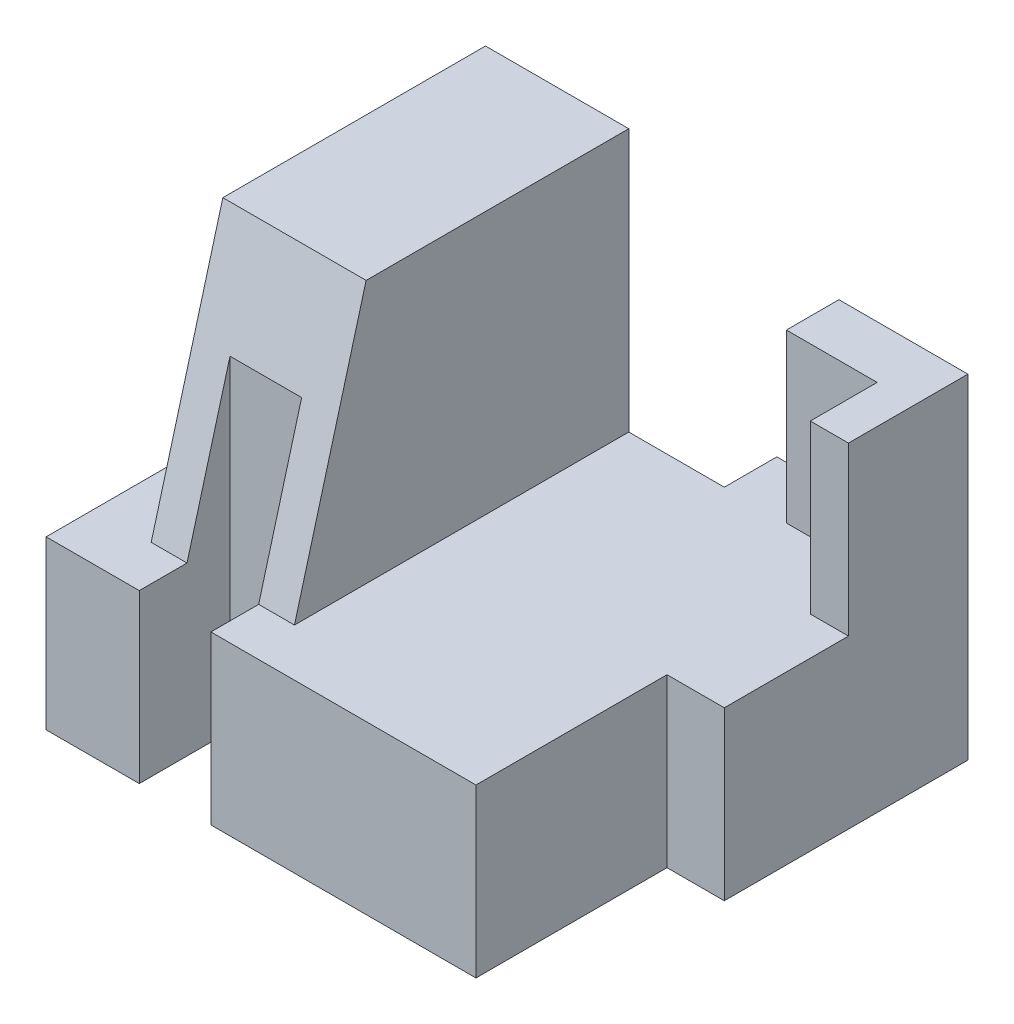
ISO-10303-21;
HEADER;
FILE_DESCRIPTION(('STEP AP214'),'2;1');
FILE_NAME('part.step','',(''),(''),'','','');
FILE_SCHEMA(('AUTOMOTIVE_DESIGN { 1 0 10303 214 1 1 1 1 }'));
ENDSEC;
DATA;
#1=APPLICATION_CONTEXT('core data for automotive mechanical design processes');
#2=APPLICATION_PROTOCOL_DEFINITION('international standard','automotive_design',2000,#1);
#3=PRODUCT_CONTEXT('',#1,'mechanical');
#4=PRODUCT('Part','Part','',(#3));
#5=PRODUCT_RELATED_PRODUCT_CATEGORY('part','',(#4));
#6=PRODUCT_DEFINITION_FORMATION('','',#4);
#7=PRODUCT_DEFINITION_CONTEXT('part definition',#1,'design');
#8=PRODUCT_DEFINITION('design','',#6,#7);
#9=PRODUCT_DEFINITION_SHAPE('','',#8);
#10=(LENGTH_UNIT() NAMED_UNIT(*) SI_UNIT(.MILLI.,.METRE.));
#11=(NAMED_UNIT(*) PLANE_ANGLE_UNIT() SI_UNIT($,.RADIAN.));
#12=(NAMED_UNIT(*) SI_UNIT($,.STERADIAN.) SOLID_ANGLE_UNIT());
#13=UNCERTAINTY_MEASURE_WITH_UNIT(LENGTH_MEASURE(1.E-05),#10,'distance_accuracy_value','');
#14=(GEOMETRIC_REPRESENTATION_CONTEXT(3) GLOBAL_UNCERTAINTY_ASSIGNED_CONTEXT((#13)) GLOBAL_UNIT_ASSIGNED_CONTEXT((#10,
#11,#12)) REPRESENTATION_CONTEXT('',''));
#15=CARTESIAN_POINT('',(0.,0.,0.));
#16=DIRECTION('',(0.,0.,1.));
#17=DIRECTION('',(1.,0.,0.));
#18=AXIS2_PLACEMENT_3D('',#15,#16,#17);
#19=CARTESIAN_POINT('',(0.,17.5,80.));
#20=DIRECTION('',(0.,1.,0.));
#21=DIRECTION('',(0.,0.,1.));
#22=AXIS2_PLACEMENT_3D('',#19,#20,#21);
#23=PLANE('',#22);
#24=DIRECTION('',(0.,0.,1.));
#25=VECTOR('',#24,1.);
#26=CARTESIAN_POINT('',(49.,17.5,14.));
#27=LINE('',#26,#25);
#28=CARTESIAN_POINT('',(49.,17.5,0.));
#29=VERTEX_POINT('',#28);
#30=CARTESIAN_POINT('',(49.,17.5,14.));
#31=VERTEX_POINT('',#30);
#32=EDGE_CURVE('E211',#29,#31,#27,.T.);
#33=ORIENTED_EDGE('',*,*,#32,.F.);
#34=DIRECTION('',(-1.,0.,0.));
#35=VECTOR('',#34,1.);
#36=CARTESIAN_POINT('',(0.,17.5,0.));
#37=LINE('',#36,#35);
#38=CARTESIAN_POINT('',(30.,17.5,0.));
#39=VERTEX_POINT('',#38);
#40=EDGE_CURVE('E222',#29,#39,#37,.T.);
#41=ORIENTED_EDGE('',*,*,#40,.T.);
#42=DIRECTION('',(0.,0.,1.));
#43=VECTOR('',#42,1.);
#44=CARTESIAN_POINT('',(30.,17.5,0.));
#45=LINE('',#44,#43);
#46=CARTESIAN_POINT('',(30.,17.5,-11.));
#47=VERTEX_POINT('',#46);
#48=EDGE_CURVE('E235',#47,#39,#45,.T.);
#49=ORIENTED_EDGE('',*,*,#48,.F.);
#50=DIRECTION('',(1.,0.,0.));
#51=VECTOR('',#50,1.);
#52=CARTESIAN_POINT('',(0.,17.5,-11.));
#53=LINE('',#52,#51);
#54=CARTESIAN_POINT('',(17.,17.5,-11.));
#55=VERTEX_POINT('',#54);
#56=EDGE_CURVE('E260',#55,#47,#53,.T.);
#57=ORIENTED_EDGE('',*,*,#56,.F.);
#58=DIRECTION('',(0.,0.,-1.));
#59=VECTOR('',#58,1.);
#60=CARTESIAN_POINT('',(17.,17.5,0.));
#61=LINE('',#60,#59);
#62=CARTESIAN_POINT('',(17.,17.5,0.));
#63=VERTEX_POINT('',#62);
#64=EDGE_CURVE('E263',#63,#55,#61,.T.);
#65=ORIENTED_EDGE('',*,*,#64,.F.);
#66=DIRECTION('',(1.,0.,0.));
#67=VECTOR('',#66,1.);
#68=CARTESIAN_POINT('',(0.,17.5,0.));
#69=LINE('',#68,#67);
#70=CARTESIAN_POINT('',(-3.00000000000004,17.5,0.));
#71=VERTEX_POINT('',#70);
#72=EDGE_CURVE('E363',#71,#63,#69,.T.);
#73=ORIENTED_EDGE('',*,*,#72,.F.);
#74=DIRECTION('',(0.,0.,1.));
#75=VECTOR('',#74,1.);
#76=CARTESIAN_POINT('',(-3.00000000000004,17.5,70.));
#77=LINE('',#76,#75);
#78=CARTESIAN_POINT('',(-3.00000000000004,17.5,70.));
#79=VERTEX_POINT('',#78);
#80=EDGE_CURVE('E299',#71,#79,#77,.T.);
#81=ORIENTED_EDGE('',*,*,#80,.T.);
#82=DIRECTION('',(-1.,0.,0.));
#83=VECTOR('',#82,1.);
#84=CARTESIAN_POINT('',(-3.00000000000004,17.5,70.));
#85=LINE('',#84,#83);
#86=CARTESIAN_POINT('',(-10.5,17.5,70.));
#87=VERTEX_POINT('',#86);
#88=EDGE_CURVE('E346',#79,#87,#85,.T.);
#89=ORIENTED_EDGE('',*,*,#88,.T.);
#90=DIRECTION('',(0.,0.,-1.));
#91=VECTOR('',#90,1.);
#92=CARTESIAN_POINT('',(-10.5,17.5,80.));
#93=LINE('',#92,#91);
#94=CARTESIAN_POINT('',(-10.5,17.5,80.));
#95=VERTEX_POINT('',#94);
#96=EDGE_CURVE('E292',#95,#87,#93,.T.);
#97=ORIENTED_EDGE('',*,*,#96,.F.);
#98=DIRECTION('',(1.,0.,0.));
#99=VECTOR('',#98,1.);
#100=CARTESIAN_POINT('',(0.,17.5,80.));
#101=LINE('',#100,#99);
#102=CARTESIAN_POINT('',(45.,17.5,80.));
#103=VERTEX_POINT('',#102);
#104=EDGE_CURVE('E344',#95,#103,#101,.T.);
#105=ORIENTED_EDGE('',*,*,#104,.T.);
#106=DIRECTION('',(0.,0.,-1.));
#107=VECTOR('',#106,1.);
#108=CARTESIAN_POINT('',(45.,17.5,80.));
#109=LINE('',#108,#107);
#110=CARTESIAN_POINT('',(45.,17.5,40.));
#111=VERTEX_POINT('',#110);
#112=EDGE_CURVE('E206',#103,#111,#109,.T.);
#113=ORIENTED_EDGE('',*,*,#112,.T.);
#114=DIRECTION('',(1.,0.,0.));
#115=VECTOR('',#114,1.);
#116=CARTESIAN_POINT('',(0.,17.5,40.));
#117=LINE('',#116,#115);
#118=CARTESIAN_POINT('',(57.,17.5,40.));
#119=VERTEX_POINT('',#118);
#120=EDGE_CURVE('E247',#111,#119,#117,.T.);
#121=ORIENTED_EDGE('',*,*,#120,.T.);
#122=DIRECTION('',(0.,0.,-1.));
#123=VECTOR('',#122,1.);
#124=CARTESIAN_POINT('',(57.,17.5,0.));
#125=LINE('',#124,#123);
#126=CARTESIAN_POINT('',(57.,17.5,14.));
#127=VERTEX_POINT('',#126);
#128=EDGE_CURVE('E257',#119,#127,#125,.T.);
#129=ORIENTED_EDGE('',*,*,#128,.T.);
#130=DIRECTION('',(1.,0.,0.));
#131=VECTOR('',#130,1.);
#132=CARTESIAN_POINT('',(0.,17.5,14.));
#133=LINE('',#132,#131);
#134=EDGE_CURVE('E213',#31,#127,#133,.T.);
#135=ORIENTED_EDGE('',*,*,#134,.F.);
#136=EDGE_LOOP('',(#33,#41,#49,#57,#65,#73,#81,#89,#97,#105,#113,#121,#129,#135));
#137=FACE_BOUND('',#136,.T.);
#138=ADVANCED_FACE('F34',(#137),#23,.T.);
#139=CARTESIAN_POINT('',(0.,0.,0.));
#140=DIRECTION('',(0.,0.,1.));
#141=DIRECTION('',(1.,0.,0.));
#142=AXIS2_PLACEMENT_3D('',#139,#140,#141);
#143=PLANE('',#142);
#144=DIRECTION('',(0.,1.,0.));
#145=VECTOR('',#144,1.);
#146=CARTESIAN_POINT('',(17.,0.,0.));
#147=LINE('',#146,#145);
#148=CARTESIAN_POINT('',(17.,-17.5,0.));
#149=VERTEX_POINT('',#148);
#150=EDGE_CURVE('E11',#149,#63,#147,.T.);
#151=ORIENTED_EDGE('',*,*,#150,.F.);
#152=DIRECTION('',(1.,0.,0.));
#153=VECTOR('',#152,1.);
#154=CARTESIAN_POINT('',(0.,-17.5,0.));
#155=LINE('',#154,#153);
#156=CARTESIAN_POINT('',(-45.,-17.5,0.));
#157=VERTEX_POINT('',#156);
#158=EDGE_CURVE('E348',#157,#149,#155,.T.);
#159=ORIENTED_EDGE('',*,*,#158,.F.);
#160=DIRECTION('',(0.,1.,0.));
#161=VECTOR('',#160,1.);
#162=CARTESIAN_POINT('',(-45.,0.,0.));
#163=LINE('',#162,#161);
#164=CARTESIAN_POINT('',(-45.,17.5,0.));
#165=VERTEX_POINT('',#164);
#166=EDGE_CURVE('E352',#157,#165,#163,.T.);
#167=ORIENTED_EDGE('',*,*,#166,.T.);
#168=CARTESIAN_POINT('',(-33.,17.5,0.));
#169=VERTEX_POINT('',#168);
#170=EDGE_CURVE('E366',#165,#169,#69,.T.);
#171=ORIENTED_EDGE('',*,*,#170,.T.);
#172=DIRECTION('',(0.,-1.,0.));
#173=VECTOR('',#172,1.);
#174=CARTESIAN_POINT('',(-33.,17.5,0.));
#175=LINE('',#174,#173);
#176=CARTESIAN_POINT('',(-33.,72.5,0.));
#177=VERTEX_POINT('',#176);
#178=EDGE_CURVE('E313',#177,#169,#175,.T.);
#179=ORIENTED_EDGE('',*,*,#178,.F.);
#180=DIRECTION('',(-1.,0.,0.));
#181=VECTOR('',#180,1.);
#182=CARTESIAN_POINT('',(-3.00000000000004,72.5,0.));
#183=LINE('',#182,#181);
#184=CARTESIAN_POINT('',(-3.00000000000004,72.5,0.));
#185=VERTEX_POINT('',#184);
#186=EDGE_CURVE('E413',#185,#177,#183,.T.);
#187=ORIENTED_EDGE('',*,*,#186,.F.);
#188=DIRECTION('',(0.,-1.,0.));
#189=VECTOR('',#188,1.);
#190=CARTESIAN_POINT('',(-3.00000000000004,17.5,0.));
#191=LINE('',#190,#189);
#192=EDGE_CURVE('E302',#185,#71,#191,.T.);
#193=ORIENTED_EDGE('',*,*,#192,.T.);
#194=ORIENTED_EDGE('',*,*,#72,.T.);
#195=EDGE_LOOP('',(#151,#159,#167,#171,#179,#187,#193,#194));
#196=FACE_BOUND('',#195,.T.);
#197=ADVANCED_FACE('F407',(#196),#143,.F.);
#198=CARTESIAN_POINT('',(0.,0.,80.));
#199=DIRECTION('',(0.,0.,1.));
#200=DIRECTION('',(1.,0.,0.));
#201=AXIS2_PLACEMENT_3D('',#198,#199,#200);
#202=PLANE('',#201);
#203=DIRECTION('',(0.,1.,0.));
#204=VECTOR('',#203,1.);
#205=CARTESIAN_POINT('',(-10.5,-17.5,80.));
#206=LINE('',#205,#204);
#207=CARTESIAN_POINT('',(-10.5,-17.5,80.));
#208=VERTEX_POINT('',#207);
#209=EDGE_CURVE('E192',#208,#95,#206,.T.);
#210=ORIENTED_EDGE('',*,*,#209,.F.);
#211=DIRECTION('',(1.,0.,0.));
#212=VECTOR('',#211,1.);
#213=CARTESIAN_POINT('',(0.,-17.5,80.));
#214=LINE('',#213,#212);
#215=CARTESIAN_POINT('',(45.,-17.5,80.));
#216=VERTEX_POINT('',#215);
#217=EDGE_CURVE('E186',#208,#216,#214,.T.);
#218=ORIENTED_EDGE('',*,*,#217,.T.);
#219=DIRECTION('',(0.,1.,0.));
#220=VECTOR('',#219,1.);
#221=CARTESIAN_POINT('',(45.,17.5,80.));
#222=LINE('',#221,#220);
#223=EDGE_CURVE('E191',#216,#103,#222,.T.);
#224=ORIENTED_EDGE('',*,*,#223,.T.);
#225=ORIENTED_EDGE('',*,*,#104,.F.);
#226=EDGE_LOOP('',(#210,#218,#224,#225));
#227=FACE_BOUND('',#226,.T.);
#228=ADVANCED_FACE('F188',(#227),#202,.T.);
#229=DIRECTION('',(0.,0.,1.));
#230=VECTOR('',#229,1.);
#231=CARTESIAN_POINT('',(-25.5,17.5,80.));
#232=LINE('',#231,#230);
#233=CARTESIAN_POINT('',(-25.5,17.5,70.));
#234=VERTEX_POINT('',#233);
#235=CARTESIAN_POINT('',(-25.5,17.5,80.));
#236=VERTEX_POINT('',#235);
#237=EDGE_CURVE('E283',#234,#236,#232,.T.);
#238=ORIENTED_EDGE('',*,*,#237,.F.);
#239=CARTESIAN_POINT('',(-33.,17.5,70.));
#240=VERTEX_POINT('',#239);
#241=EDGE_CURVE('E425',#234,#240,#85,.T.);
#242=ORIENTED_EDGE('',*,*,#241,.T.);
#243=DIRECTION('',(0.,0.,1.));
#244=VECTOR('',#243,1.);
#245=CARTESIAN_POINT('',(-33.,17.5,70.));
#246=LINE('',#245,#244);
#247=EDGE_CURVE('E294',#169,#240,#246,.T.);
#248=ORIENTED_EDGE('',*,*,#247,.F.);
#249=ORIENTED_EDGE('',*,*,#170,.F.);
#250=DIRECTION('',(0.,0.,-1.));
#251=VECTOR('',#250,1.);
#252=CARTESIAN_POINT('',(-45.,17.5,80.));
#253=LINE('',#252,#251);
#254=CARTESIAN_POINT('',(-45.,17.5,80.));
#255=VERTEX_POINT('',#254);
#256=EDGE_CURVE('E321',#255,#165,#253,.T.);
#257=ORIENTED_EDGE('',*,*,#256,.F.);
#258=EDGE_CURVE('E347',#255,#236,#101,.T.);
#259=ORIENTED_EDGE('',*,*,#258,.T.);
#260=EDGE_LOOP('',(#238,#242,#248,#249,#257,#259));
#261=FACE_BOUND('',#260,.T.);
#262=ADVANCED_FACE('F36',(#261),#23,.T.);
#263=CARTESIAN_POINT('',(-45.,0.,80.));
#264=DIRECTION('',(-1.,0.,0.));
#265=DIRECTION('',(0.,0.,1.));
#266=AXIS2_PLACEMENT_3D('',#263,#264,#265);
#267=PLANE('',#266);
#268=ORIENTED_EDGE('',*,*,#166,.F.);
#269=DIRECTION('',(0.,0.,-1.));
#270=VECTOR('',#269,1.);
#271=CARTESIAN_POINT('',(-45.,-17.5,80.));
#272=LINE('',#271,#270);
#273=CARTESIAN_POINT('',(-45.,-17.5,80.));
#274=VERTEX_POINT('',#273);
#275=EDGE_CURVE('E370',#274,#157,#272,.T.);
#276=ORIENTED_EDGE('',*,*,#275,.F.);
#277=DIRECTION('',(0.,1.,0.));
#278=VECTOR('',#277,1.);
#279=CARTESIAN_POINT('',(-45.,0.,80.));
#280=LINE('',#279,#278);
#281=EDGE_CURVE('E196',#274,#255,#280,.T.);
#282=ORIENTED_EDGE('',*,*,#281,.T.);
#283=ORIENTED_EDGE('',*,*,#256,.T.);
#284=EDGE_LOOP('',(#268,#276,#282,#283));
#285=FACE_BOUND('',#284,.T.);
#286=ADVANCED_FACE('F447',(#285),#267,.T.);
#287=CARTESIAN_POINT('',(0.,-17.5,80.));
#288=DIRECTION('',(0.,1.,0.));
#289=DIRECTION('',(0.,0.,1.));
#290=AXIS2_PLACEMENT_3D('',#287,#288,#289);
#291=PLANE('',#290);
#292=DIRECTION('',(-1.,0.,0.));
#293=VECTOR('',#292,1.);
#294=CARTESIAN_POINT('',(0.,-17.5,40.));
#295=LINE('',#294,#293);
#296=CARTESIAN_POINT('',(57.,-17.5,40.));
#297=VERTEX_POINT('',#296);
#298=CARTESIAN_POINT('',(45.,-17.5,40.));
#299=VERTEX_POINT('',#298);
#300=EDGE_CURVE('E201',#297,#299,#295,.T.);
#301=ORIENTED_EDGE('',*,*,#300,.T.);
#302=DIRECTION('',(0.,0.,1.));
#303=VECTOR('',#302,1.);
#304=CARTESIAN_POINT('',(45.,-17.5,1.92113447068046));
#305=LINE('',#304,#303);
#306=EDGE_CURVE('E199',#299,#216,#305,.T.);
#307=ORIENTED_EDGE('',*,*,#306,.T.);
#308=ORIENTED_EDGE('',*,*,#217,.F.);
#309=DIRECTION('',(0.,0.,-1.));
#310=VECTOR('',#309,1.);
#311=CARTESIAN_POINT('',(-10.5,-17.5,61.));
#312=LINE('',#311,#310);
#313=CARTESIAN_POINT('',(-10.5,-17.5,61.));
#314=VERTEX_POINT('',#313);
#315=EDGE_CURVE('E273',#208,#314,#312,.T.);
#316=ORIENTED_EDGE('',*,*,#315,.T.);
#317=DIRECTION('',(-1.,0.,0.));
#318=VECTOR('',#317,1.);
#319=CARTESIAN_POINT('',(-25.5,-17.5,61.));
#320=LINE('',#319,#318);
#321=CARTESIAN_POINT('',(-25.5,-17.5,61.));
#322=VERTEX_POINT('',#321);
#323=EDGE_CURVE('E275',#314,#322,#320,.T.);
#324=ORIENTED_EDGE('',*,*,#323,.T.);
#325=DIRECTION('',(0.,0.,1.));
#326=VECTOR('',#325,1.);
#327=CARTESIAN_POINT('',(-25.5,-17.5,61.));
#328=LINE('',#327,#326);
#329=CARTESIAN_POINT('',(-25.5,-17.5,80.));
#330=VERTEX_POINT('',#329);
#331=EDGE_CURVE('E278',#322,#330,#328,.T.);
#332=ORIENTED_EDGE('',*,*,#331,.T.);
#333=EDGE_CURVE('E195',#274,#330,#214,.T.);
#334=ORIENTED_EDGE('',*,*,#333,.F.);
#335=ORIENTED_EDGE('',*,*,#275,.T.);
#336=ORIENTED_EDGE('',*,*,#158,.T.);
#337=DIRECTION('',(0.,0.,1.));
#338=VECTOR('',#337,1.);
#339=CARTESIAN_POINT('',(17.,-17.5,0.));
#340=LINE('',#339,#338);
#341=CARTESIAN_POINT('',(17.,-17.5,-11.));
#342=VERTEX_POINT('',#341);
#343=EDGE_CURVE('E251',#342,#149,#340,.T.);
#344=ORIENTED_EDGE('',*,*,#343,.F.);
#345=DIRECTION('',(-1.,0.,0.));
#346=VECTOR('',#345,1.);
#347=CARTESIAN_POINT('',(0.,-17.5,-11.));
#348=LINE('',#347,#346);
#349=CARTESIAN_POINT('',(57.,-17.5,-11.));
#350=VERTEX_POINT('',#349);
#351=EDGE_CURVE('E248',#350,#342,#348,.T.);
#352=ORIENTED_EDGE('',*,*,#351,.F.);
#353=DIRECTION('',(0.,0.,1.));
#354=VECTOR('',#353,1.);
#355=CARTESIAN_POINT('',(57.,-17.5,0.));
#356=LINE('',#355,#354);
#357=EDGE_CURVE('E255',#350,#297,#356,.T.);
#358=ORIENTED_EDGE('',*,*,#357,.T.);
#359=EDGE_LOOP('',(#301,#307,#308,#316,#324,#332,#334,#335,#336,#344,#352,#358));
#360=FACE_BOUND('',#359,.T.);
#361=ADVANCED_FACE('F200',(#360),#291,.F.);
#362=DIRECTION('',(0.,1.,0.));
#363=VECTOR('',#362,1.);
#364=CARTESIAN_POINT('',(-25.5,-17.5,80.));
#365=LINE('',#364,#363);
#366=EDGE_CURVE('E284',#330,#236,#365,.T.);
#367=ORIENTED_EDGE('',*,*,#366,.T.);
#368=ORIENTED_EDGE('',*,*,#258,.F.);
#369=ORIENTED_EDGE('',*,*,#281,.F.);
#370=ORIENTED_EDGE('',*,*,#333,.T.);
#371=EDGE_LOOP('',(#367,#368,#369,#370));
#372=FACE_BOUND('',#371,.T.);
#373=ADVANCED_FACE('F430',(#372),#202,.T.);
#374=CARTESIAN_POINT('',(-3.00000000000004,72.5,0.));
#375=DIRECTION('',(0.,1.,0.));
#376=DIRECTION('',(0.,0.,1.));
#377=AXIS2_PLACEMENT_3D('',#374,#375,#376);
#378=PLANE('',#377);
#379=DIRECTION('',(0.,0.,-1.));
#380=VECTOR('',#379,1.);
#381=CARTESIAN_POINT('',(-33.,72.5,0.));
#382=LINE('',#381,#380);
#383=CARTESIAN_POINT('',(-33.,72.5,55.));
#384=VERTEX_POINT('',#383);
#385=EDGE_CURVE('E315',#384,#177,#382,.T.);
#386=ORIENTED_EDGE('',*,*,#385,.F.);
#387=DIRECTION('',(-1.,0.,0.));
#388=VECTOR('',#387,1.);
#389=CARTESIAN_POINT('',(-3.00000000000004,72.5,55.));
#390=LINE('',#389,#388);
#391=CARTESIAN_POINT('',(-3.00000000000004,72.5,55.));
#392=VERTEX_POINT('',#391);
#393=EDGE_CURVE('E414',#392,#384,#390,.T.);
#394=ORIENTED_EDGE('',*,*,#393,.F.);
#395=DIRECTION('',(0.,0.,-1.));
#396=VECTOR('',#395,1.);
#397=CARTESIAN_POINT('',(-3.00000000000004,72.5,0.));
#398=LINE('',#397,#396);
#399=EDGE_CURVE('E298',#392,#185,#398,.T.);
#400=ORIENTED_EDGE('',*,*,#399,.T.);
#401=ORIENTED_EDGE('',*,*,#186,.T.);
#402=EDGE_LOOP('',(#386,#394,#400,#401));
#403=FACE_BOUND('',#402,.T.);
#404=ADVANCED_FACE('F428',(#403),#378,.T.);
#405=CARTESIAN_POINT('',(-3.00000000000004,72.5,55.));
#406=DIRECTION('',(0.,0.263117405792109,0.964763821237732));
#407=DIRECTION('',(0.,-0.964763821237732,0.263117405792109));
#408=AXIS2_PLACEMENT_3D('',#405,#406,#407);
#409=PLANE('',#408);
#410=DIRECTION('',(0.,0.964763821237732,-0.263117405792109));
#411=VECTOR('',#410,1.);
#412=CARTESIAN_POINT('',(-10.5,72.5,55.));
#413=LINE('',#412,#411);
#414=CARTESIAN_POINT('',(-10.5,50.5,61.));
#415=VERTEX_POINT('',#414);
#416=EDGE_CURVE('E42',#87,#415,#413,.T.);
#417=ORIENTED_EDGE('',*,*,#416,.F.);
#418=ORIENTED_EDGE('',*,*,#88,.F.);
#419=DIRECTION('',(0.,0.964763821237732,-0.263117405792109));
#420=VECTOR('',#419,1.);
#421=CARTESIAN_POINT('',(-3.00000000000004,72.5,55.));
#422=LINE('',#421,#420);
#423=EDGE_CURVE('E295',#79,#392,#422,.T.);
#424=ORIENTED_EDGE('',*,*,#423,.T.);
#425=ORIENTED_EDGE('',*,*,#393,.T.);
#426=DIRECTION('',(0.,0.964763821237732,-0.263117405792109));
#427=VECTOR('',#426,1.);
#428=CARTESIAN_POINT('',(-33.,72.5,55.));
#429=LINE('',#428,#427);
#430=EDGE_CURVE('E305',#240,#384,#429,.T.);
#431=ORIENTED_EDGE('',*,*,#430,.F.);
#432=ORIENTED_EDGE('',*,*,#241,.F.);
#433=DIRECTION('',(0.,-0.964763821237732,0.263117405792109));
#434=VECTOR('',#433,1.);
#435=CARTESIAN_POINT('',(-25.5,72.5,55.));
#436=LINE('',#435,#434);
#437=CARTESIAN_POINT('',(-25.5,50.5,61.));
#438=VERTEX_POINT('',#437);
#439=EDGE_CURVE('E320',#438,#234,#436,.T.);
#440=ORIENTED_EDGE('',*,*,#439,.F.);
#441=DIRECTION('',(-1.,0.,0.));
#442=VECTOR('',#441,1.);
#443=CARTESIAN_POINT('',(-3.00000000000004,50.5,61.));
#444=LINE('',#443,#442);
#445=EDGE_CURVE('E318',#415,#438,#444,.T.);
#446=ORIENTED_EDGE('',*,*,#445,.F.);
#447=EDGE_LOOP('',(#417,#418,#424,#425,#431,#432,#440,#446));
#448=FACE_BOUND('',#447,.T.);
#449=ADVANCED_FACE('F332',(#448),#409,.T.);
#450=CARTESIAN_POINT('',(-3.00000000000004,0.,0.));
#451=DIRECTION('',(1.,0.,0.));
#452=DIRECTION('',(0.,0.,-1.));
#453=AXIS2_PLACEMENT_3D('',#450,#451,#452);
#454=PLANE('',#453);
#455=ORIENTED_EDGE('',*,*,#80,.F.);
#456=ORIENTED_EDGE('',*,*,#192,.F.);
#457=ORIENTED_EDGE('',*,*,#399,.F.);
#458=ORIENTED_EDGE('',*,*,#423,.F.);
#459=EDGE_LOOP('',(#455,#456,#457,#458));
#460=FACE_BOUND('',#459,.T.);
#461=ADVANCED_FACE('F436',(#460),#454,.T.);
#462=CARTESIAN_POINT('',(-33.,0.,0.));
#463=DIRECTION('',(1.,0.,0.));
#464=DIRECTION('',(0.,0.,-1.));
#465=AXIS2_PLACEMENT_3D('',#462,#463,#464);
#466=PLANE('',#465);
#467=ORIENTED_EDGE('',*,*,#247,.T.);
#468=ORIENTED_EDGE('',*,*,#430,.T.);
#469=ORIENTED_EDGE('',*,*,#385,.T.);
#470=ORIENTED_EDGE('',*,*,#178,.T.);
#471=EDGE_LOOP('',(#467,#468,#469,#470));
#472=FACE_BOUND('',#471,.T.);
#473=ADVANCED_FACE('F423',(#472),#466,.F.);
#474=CARTESIAN_POINT('',(-10.5,-17.5,61.));
#475=DIRECTION('',(1.,0.,0.));
#476=DIRECTION('',(0.,0.,-1.));
#477=AXIS2_PLACEMENT_3D('',#474,#475,#476);
#478=PLANE('',#477);
#479=ORIENTED_EDGE('',*,*,#96,.T.);
#480=ORIENTED_EDGE('',*,*,#416,.T.);
#481=DIRECTION('',(0.,1.,0.));
#482=VECTOR('',#481,1.);
#483=CARTESIAN_POINT('',(-10.5,-17.5,61.));
#484=LINE('',#483,#482);
#485=EDGE_CURVE('E281',#314,#415,#484,.T.);
#486=ORIENTED_EDGE('',*,*,#485,.F.);
#487=ORIENTED_EDGE('',*,*,#315,.F.);
#488=ORIENTED_EDGE('',*,*,#209,.T.);
#489=EDGE_LOOP('',(#479,#480,#486,#487,#488));
#490=FACE_BOUND('',#489,.T.);
#491=ADVANCED_FACE('F326',(#490),#478,.F.);
#492=CARTESIAN_POINT('',(-25.5,-17.5,61.));
#493=DIRECTION('',(-1.,0.,0.));
#494=DIRECTION('',(0.,0.,1.));
#495=AXIS2_PLACEMENT_3D('',#492,#493,#494);
#496=PLANE('',#495);
#497=ORIENTED_EDGE('',*,*,#237,.T.);
#498=ORIENTED_EDGE('',*,*,#366,.F.);
#499=ORIENTED_EDGE('',*,*,#331,.F.);
#500=DIRECTION('',(0.,1.,0.));
#501=VECTOR('',#500,1.);
#502=CARTESIAN_POINT('',(-25.5,-17.5,61.));
#503=LINE('',#502,#501);
#504=EDGE_CURVE('E287',#322,#438,#503,.T.);
#505=ORIENTED_EDGE('',*,*,#504,.T.);
#506=ORIENTED_EDGE('',*,*,#439,.T.);
#507=EDGE_LOOP('',(#497,#498,#499,#505,#506));
#508=FACE_BOUND('',#507,.T.);
#509=ADVANCED_FACE('F338',(#508),#496,.F.);
#510=CARTESIAN_POINT('',(-25.5,-17.5,61.));
#511=DIRECTION('',(0.,0.,-1.));
#512=DIRECTION('',(-1.,0.,0.));
#513=AXIS2_PLACEMENT_3D('',#510,#511,#512);
#514=PLANE('',#513);
#515=ORIENTED_EDGE('',*,*,#445,.T.);
#516=ORIENTED_EDGE('',*,*,#504,.F.);
#517=ORIENTED_EDGE('',*,*,#323,.F.);
#518=ORIENTED_EDGE('',*,*,#485,.T.);
#519=EDGE_LOOP('',(#515,#516,#517,#518));
#520=FACE_BOUND('',#519,.T.);
#521=ADVANCED_FACE('F335',(#520),#514,.F.);
#522=CARTESIAN_POINT('',(0.,-82.3151216923952,40.));
#523=DIRECTION('',(0.,0.,1.));
#524=DIRECTION('',(1.,0.,0.));
#525=AXIS2_PLACEMENT_3D('',#522,#523,#524);
#526=PLANE('',#525);
#527=DIRECTION('',(0.,-1.,0.));
#528=VECTOR('',#527,1.);
#529=CARTESIAN_POINT('',(45.,17.5,40.));
#530=LINE('',#529,#528);
#531=EDGE_CURVE('E49',#111,#299,#530,.T.);
#532=ORIENTED_EDGE('',*,*,#531,.T.);
#533=ORIENTED_EDGE('',*,*,#300,.F.);
#534=DIRECTION('',(0.,1.,0.));
#535=VECTOR('',#534,1.);
#536=CARTESIAN_POINT('',(57.,-82.3151216923952,40.));
#537=LINE('',#536,#535);
#538=EDGE_CURVE('E265',#297,#119,#537,.T.);
#539=ORIENTED_EDGE('',*,*,#538,.T.);
#540=ORIENTED_EDGE('',*,*,#120,.F.);
#541=EDGE_LOOP('',(#532,#533,#539,#540));
#542=FACE_BOUND('',#541,.T.);
#543=ADVANCED_FACE('F372',(#542),#526,.T.);
#544=CARTESIAN_POINT('',(17.,-82.3151216923952,0.));
#545=DIRECTION('',(1.,0.,0.));
#546=DIRECTION('',(0.,0.,-1.));
#547=AXIS2_PLACEMENT_3D('',#544,#545,#546);
#548=PLANE('',#547);
#549=ORIENTED_EDGE('',*,*,#343,.T.);
#550=ORIENTED_EDGE('',*,*,#150,.T.);
#551=ORIENTED_EDGE('',*,*,#64,.T.);
#552=DIRECTION('',(0.,1.,0.));
#553=VECTOR('',#552,1.);
#554=CARTESIAN_POINT('',(17.,-82.3151216923952,-11.));
#555=LINE('',#554,#553);
#556=EDGE_CURVE('E252',#342,#55,#555,.T.);
#557=ORIENTED_EDGE('',*,*,#556,.F.);
#558=EDGE_LOOP('',(#549,#550,#551,#557));
#559=FACE_BOUND('',#558,.T.);
#560=ADVANCED_FACE('F404',(#559),#548,.F.);
#561=CARTESIAN_POINT('',(0.,-82.3151216923952,-11.));
#562=DIRECTION('',(0.,0.,1.));
#563=DIRECTION('',(1.,0.,0.));
#564=AXIS2_PLACEMENT_3D('',#561,#562,#563);
#565=PLANE('',#564);
#566=DIRECTION('',(0.,1.,0.));
#567=VECTOR('',#566,1.);
#568=CARTESIAN_POINT('',(57.,-82.3151216923952,-11.));
#569=LINE('',#568,#567);
#570=CARTESIAN_POINT('',(57.,52.5,-11.));
#571=VERTEX_POINT('',#570);
#572=EDGE_CURVE('E268',#350,#571,#569,.T.);
#573=ORIENTED_EDGE('',*,*,#572,.F.);
#574=ORIENTED_EDGE('',*,*,#351,.T.);
#575=ORIENTED_EDGE('',*,*,#556,.T.);
#576=ORIENTED_EDGE('',*,*,#56,.T.);
#577=DIRECTION('',(0.,-1.,0.));
#578=VECTOR('',#577,1.);
#579=CARTESIAN_POINT('',(30.,52.5,-11.));
#580=LINE('',#579,#578);
#581=CARTESIAN_POINT('',(30.,52.5,-11.));
#582=VERTEX_POINT('',#581);
#583=EDGE_CURVE('E241',#582,#47,#580,.T.);
#584=ORIENTED_EDGE('',*,*,#583,.F.);
#585=DIRECTION('',(1.,0.,0.));
#586=VECTOR('',#585,1.);
#587=CARTESIAN_POINT('',(0.,52.5,-11.));
#588=LINE('',#587,#586);
#589=EDGE_CURVE('E225',#582,#571,#588,.T.);
#590=ORIENTED_EDGE('',*,*,#589,.T.);
#591=EDGE_LOOP('',(#573,#574,#575,#576,#584,#590));
#592=FACE_BOUND('',#591,.T.);
#593=ADVANCED_FACE('F397',(#592),#565,.F.);
#594=CARTESIAN_POINT('',(57.,-82.3151216923952,0.));
#595=DIRECTION('',(1.,0.,0.));
#596=DIRECTION('',(0.,0.,-1.));
#597=AXIS2_PLACEMENT_3D('',#594,#595,#596);
#598=PLANE('',#597);
#599=ORIENTED_EDGE('',*,*,#357,.F.);
#600=ORIENTED_EDGE('',*,*,#572,.T.);
#601=DIRECTION('',(0.,0.,-1.));
#602=VECTOR('',#601,1.);
#603=CARTESIAN_POINT('',(57.,52.5,0.));
#604=LINE('',#603,#602);
#605=CARTESIAN_POINT('',(57.,52.5,14.));
#606=VERTEX_POINT('',#605);
#607=EDGE_CURVE('E221',#606,#571,#604,.T.);
#608=ORIENTED_EDGE('',*,*,#607,.F.);
#609=DIRECTION('',(0.,-1.,0.));
#610=VECTOR('',#609,1.);
#611=CARTESIAN_POINT('',(57.,52.5,14.));
#612=LINE('',#611,#610);
#613=EDGE_CURVE('E244',#606,#127,#612,.T.);
#614=ORIENTED_EDGE('',*,*,#613,.T.);
#615=ORIENTED_EDGE('',*,*,#128,.F.);
#616=ORIENTED_EDGE('',*,*,#538,.F.);
#617=EDGE_LOOP('',(#599,#600,#608,#614,#615,#616));
#618=FACE_BOUND('',#617,.T.);
#619=ADVANCED_FACE('F377',(#618),#598,.T.);
#620=CARTESIAN_POINT('',(0.,52.5,14.));
#621=DIRECTION('',(0.,0.,-1.));
#622=DIRECTION('',(-1.,0.,0.));
#623=AXIS2_PLACEMENT_3D('',#620,#621,#622);
#624=PLANE('',#623);
#625=DIRECTION('',(1.,0.,0.));
#626=VECTOR('',#625,1.);
#627=CARTESIAN_POINT('',(0.,52.5,14.));
#628=LINE('',#627,#626);
#629=CARTESIAN_POINT('',(49.,52.5,14.));
#630=VERTEX_POINT('',#629);
#631=EDGE_CURVE('E219',#630,#606,#628,.T.);
#632=ORIENTED_EDGE('',*,*,#631,.F.);
#633=DIRECTION('',(0.,1.,0.));
#634=VECTOR('',#633,1.);
#635=CARTESIAN_POINT('',(49.,2.93978022143898,14.));
#636=LINE('',#635,#634);
#637=EDGE_CURVE('E57',#31,#630,#636,.T.);
#638=ORIENTED_EDGE('',*,*,#637,.F.);
#639=ORIENTED_EDGE('',*,*,#134,.T.);
#640=ORIENTED_EDGE('',*,*,#613,.F.);
#641=EDGE_LOOP('',(#632,#638,#639,#640));
#642=FACE_BOUND('',#641,.T.);
#643=ADVANCED_FACE('F384',(#642),#624,.F.);
#644=CARTESIAN_POINT('',(30.,52.5,0.));
#645=DIRECTION('',(1.,0.,0.));
#646=DIRECTION('',(0.,0.,-1.));
#647=AXIS2_PLACEMENT_3D('',#644,#645,#646);
#648=PLANE('',#647);
#649=ORIENTED_EDGE('',*,*,#48,.T.);
#650=DIRECTION('',(0.,-1.,0.));
#651=VECTOR('',#650,1.);
#652=CARTESIAN_POINT('',(30.,52.5,0.));
#653=LINE('',#652,#651);
#654=CARTESIAN_POINT('',(30.,52.5,0.));
#655=VERTEX_POINT('',#654);
#656=EDGE_CURVE('E233',#655,#39,#653,.T.);
#657=ORIENTED_EDGE('',*,*,#656,.F.);
#658=DIRECTION('',(0.,0.,1.));
#659=VECTOR('',#658,1.);
#660=CARTESIAN_POINT('',(30.,52.5,0.));
#661=LINE('',#660,#659);
#662=EDGE_CURVE('E228',#582,#655,#661,.T.);
#663=ORIENTED_EDGE('',*,*,#662,.F.);
#664=ORIENTED_EDGE('',*,*,#583,.T.);
#665=EDGE_LOOP('',(#649,#657,#663,#664));
#666=FACE_BOUND('',#665,.T.);
#667=ADVANCED_FACE('F400',(#666),#648,.F.);
#668=CARTESIAN_POINT('',(0.,52.5,0.));
#669=DIRECTION('',(0.,0.,1.));
#670=DIRECTION('',(1.,0.,0.));
#671=AXIS2_PLACEMENT_3D('',#668,#669,#670);
#672=PLANE('',#671);
#673=ORIENTED_EDGE('',*,*,#40,.F.);
#674=DIRECTION('',(0.,1.,0.));
#675=VECTOR('',#674,1.);
#676=CARTESIAN_POINT('',(49.,2.93978022143898,0.));
#677=LINE('',#676,#675);
#678=CARTESIAN_POINT('',(49.,52.5,0.));
#679=VERTEX_POINT('',#678);
#680=EDGE_CURVE('E214',#29,#679,#677,.T.);
#681=ORIENTED_EDGE('',*,*,#680,.T.);
#682=DIRECTION('',(-1.,0.,0.));
#683=VECTOR('',#682,1.);
#684=CARTESIAN_POINT('',(0.,52.5,0.));
#685=LINE('',#684,#683);
#686=EDGE_CURVE('E230',#679,#655,#685,.T.);
#687=ORIENTED_EDGE('',*,*,#686,.T.);
#688=ORIENTED_EDGE('',*,*,#656,.T.);
#689=EDGE_LOOP('',(#673,#681,#687,#688));
#690=FACE_BOUND('',#689,.T.);
#691=ADVANCED_FACE('F390',(#690),#672,.T.);
#692=CARTESIAN_POINT('',(0.,52.5,0.));
#693=DIRECTION('',(0.,1.,0.));
#694=DIRECTION('',(0.,0.,1.));
#695=AXIS2_PLACEMENT_3D('',#692,#693,#694);
#696=PLANE('',#695);
#697=ORIENTED_EDGE('',*,*,#686,.F.);
#698=DIRECTION('',(0.,0.,-1.));
#699=VECTOR('',#698,1.);
#700=CARTESIAN_POINT('',(49.,52.5,14.));
#701=LINE('',#700,#699);
#702=EDGE_CURVE('E210',#630,#679,#701,.T.);
#703=ORIENTED_EDGE('',*,*,#702,.F.);
#704=ORIENTED_EDGE('',*,*,#631,.T.);
#705=ORIENTED_EDGE('',*,*,#607,.T.);
#706=ORIENTED_EDGE('',*,*,#589,.F.);
#707=ORIENTED_EDGE('',*,*,#662,.T.);
#708=EDGE_LOOP('',(#697,#703,#704,#705,#706,#707));
#709=FACE_BOUND('',#708,.T.);
#710=ADVANCED_FACE('F386',(#709),#696,.T.);
#711=CARTESIAN_POINT('',(49.,2.93978022143898,14.));
#712=DIRECTION('',(1.,0.,0.));
#713=DIRECTION('',(0.,0.,-1.));
#714=AXIS2_PLACEMENT_3D('',#711,#712,#713);
#715=PLANE('',#714);
#716=ORIENTED_EDGE('',*,*,#32,.T.);
#717=ORIENTED_EDGE('',*,*,#637,.T.);
#718=ORIENTED_EDGE('',*,*,#702,.T.);
#719=ORIENTED_EDGE('',*,*,#680,.F.);
#720=EDGE_LOOP('',(#716,#717,#718,#719));
#721=FACE_BOUND('',#720,.T.);
#722=ADVANCED_FACE('F388',(#721),#715,.F.);
#723=CARTESIAN_POINT('',(45.,17.5,1.92113447068046));
#724=DIRECTION('',(1.,0.,0.));
#725=DIRECTION('',(0.,0.,-1.));
#726=AXIS2_PLACEMENT_3D('',#723,#724,#725);
#727=PLANE('',#726);
#728=ORIENTED_EDGE('',*,*,#531,.F.);
#729=ORIENTED_EDGE('',*,*,#112,.F.);
#730=ORIENTED_EDGE('',*,*,#223,.F.);
#731=ORIENTED_EDGE('',*,*,#306,.F.);
#732=EDGE_LOOP('',(#728,#729,#730,#731));
#733=FACE_BOUND('',#732,.T.);
#734=ADVANCED_FACE('F205',(#733),#727,.T.);
#735=CLOSED_SHELL('',(#138,#197,#228,#262,#286,#361,#373,#404,#449,#461,#473,#491,#509,#521,
#543,#560,#593,#619,#643,#667,#691,#710,#722,#734));
#736=MANIFOLD_SOLID_BREP('B2',#735);
#737=ADVANCED_BREP_SHAPE_REPRESENTATION('',(#18,#736),#14);
#738=SHAPE_DEFINITION_REPRESENTATION(#9,#737);
ENDSEC;
END-ISO-10303-21;
